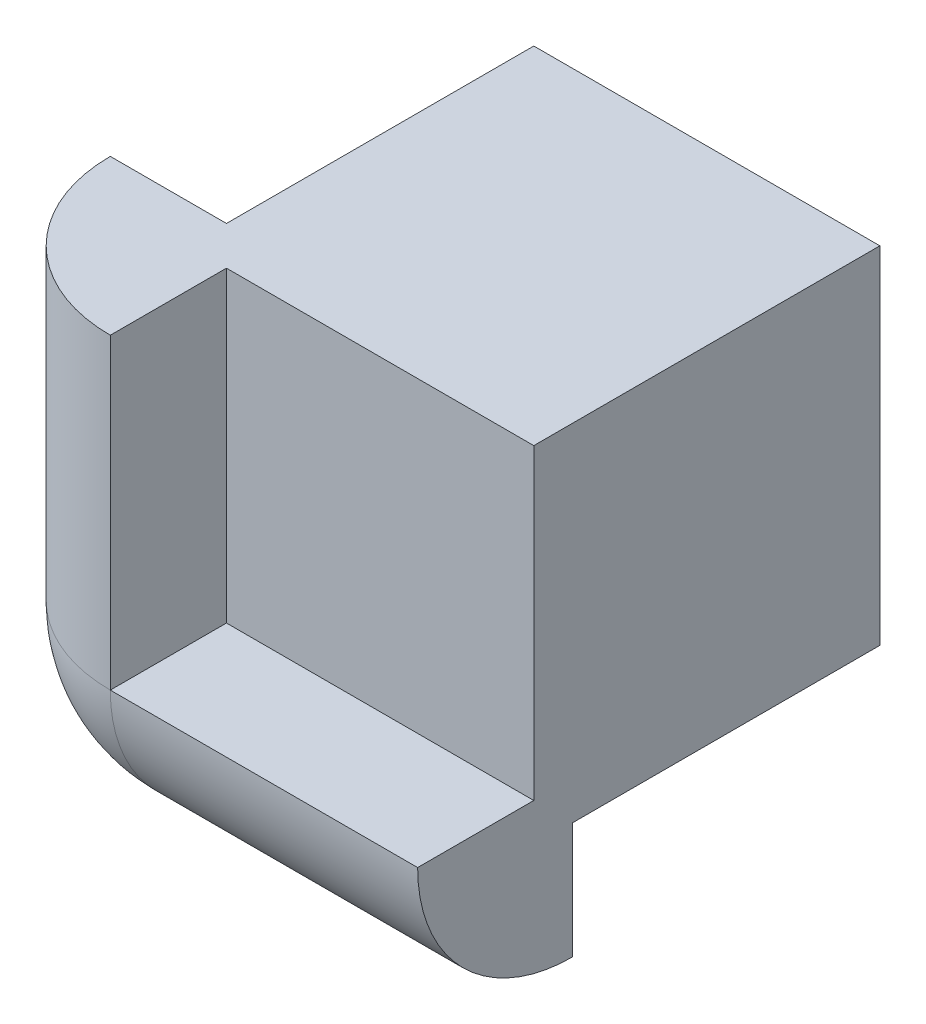
ISO-10303-21;
HEADER;
FILE_DESCRIPTION(('STEP AP214'),'2;1');
FILE_NAME('part.step','',(''),(''),'','','');
FILE_SCHEMA(('AUTOMOTIVE_DESIGN { 1 0 10303 214 1 1 1 1 }'));
ENDSEC;
DATA;
#1=APPLICATION_CONTEXT('core data for automotive mechanical design processes');
#2=APPLICATION_PROTOCOL_DEFINITION('international standard','automotive_design',2000,#1);
#3=PRODUCT_CONTEXT('',#1,'mechanical');
#4=PRODUCT('Part','Part','',(#3));
#5=PRODUCT_RELATED_PRODUCT_CATEGORY('part','',(#4));
#6=PRODUCT_DEFINITION_FORMATION('','',#4);
#7=PRODUCT_DEFINITION_CONTEXT('part definition',#1,'design');
#8=PRODUCT_DEFINITION('design','',#6,#7);
#9=PRODUCT_DEFINITION_SHAPE('','',#8);
#10=(LENGTH_UNIT() NAMED_UNIT(*) SI_UNIT(.MILLI.,.METRE.));
#11=(NAMED_UNIT(*) PLANE_ANGLE_UNIT() SI_UNIT($,.RADIAN.));
#12=(NAMED_UNIT(*) SI_UNIT($,.STERADIAN.) SOLID_ANGLE_UNIT());
#13=UNCERTAINTY_MEASURE_WITH_UNIT(LENGTH_MEASURE(1.E-05),#10,'distance_accuracy_value','');
#14=(GEOMETRIC_REPRESENTATION_CONTEXT(3) GLOBAL_UNCERTAINTY_ASSIGNED_CONTEXT((#13)) GLOBAL_UNIT_ASSIGNED_CONTEXT((#10,
#11,#12)) REPRESENTATION_CONTEXT('',''));
#15=CARTESIAN_POINT('',(0.,0.,0.));
#16=DIRECTION('',(0.,0.,1.));
#17=DIRECTION('',(1.,0.,0.));
#18=AXIS2_PLACEMENT_3D('',#15,#16,#17);
#19=CARTESIAN_POINT('',(8.937498,8.937498,-8.937498));
#20=DIRECTION('',(-1.,0.,0.));
#21=DIRECTION('',(0.,0.,1.));
#22=AXIS2_PLACEMENT_3D('',#19,#20,#21);
#23=PLANE('',#22);
#24=DIRECTION('',(0.,0.,-1.));
#25=VECTOR('',#24,1.);
#26=CARTESIAN_POINT('',(8.937498,0.999999999999997,-1.));
#27=LINE('',#26,#25);
#28=CARTESIAN_POINT('',(8.937498,0.999999999999996,3.));
#29=VERTEX_POINT('',#28);
#30=CARTESIAN_POINT('',(8.937498,0.999999999999997,0.));
#31=VERTEX_POINT('',#30);
#32=EDGE_CURVE('E122',#29,#31,#27,.T.);
#33=ORIENTED_EDGE('',*,*,#32,.F.);
#34=CARTESIAN_POINT('',(8.937498,0.999999999999995,-0.999999999999999));
#35=DIRECTION('',(-1.,0.,0.));
#36=DIRECTION('',(0.,0.,1.));
#37=AXIS2_PLACEMENT_3D('',#34,#35,#36);
#38=CIRCLE('',#37,4.);
#39=CARTESIAN_POINT('',(8.937498,-3.00000000000001,-0.999999999999999));
#40=VERTEX_POINT('',#39);
#41=EDGE_CURVE('E42',#29,#40,#38,.F.);
#42=ORIENTED_EDGE('',*,*,#41,.T.);
#43=DIRECTION('',(0.,-1.,0.));
#44=VECTOR('',#43,1.);
#45=CARTESIAN_POINT('',(8.937498,0.999999999999997,-1.));
#46=LINE('',#45,#44);
#47=CARTESIAN_POINT('',(8.937498,0.,-0.999999999999999));
#48=VERTEX_POINT('',#47);
#49=EDGE_CURVE('E119',#48,#40,#46,.T.);
#50=ORIENTED_EDGE('',*,*,#49,.F.);
#51=DIRECTION('',(0.,0.,-1.));
#52=VECTOR('',#51,1.);
#53=CARTESIAN_POINT('',(8.937498,0.,-8.937498));
#54=LINE('',#53,#52);
#55=CARTESIAN_POINT('',(8.937498,0.,-8.937498));
#56=VERTEX_POINT('',#55);
#57=EDGE_CURVE('E166',#48,#56,#54,.T.);
#58=ORIENTED_EDGE('',*,*,#57,.T.);
#59=DIRECTION('',(0.,-1.,0.));
#60=VECTOR('',#59,1.);
#61=CARTESIAN_POINT('',(8.937498,8.937498,-8.937498));
#62=LINE('',#61,#60);
#63=CARTESIAN_POINT('',(8.937498,8.937498,-8.937498));
#64=VERTEX_POINT('',#63);
#65=EDGE_CURVE('E198',#64,#56,#62,.T.);
#66=ORIENTED_EDGE('',*,*,#65,.F.);
#67=DIRECTION('',(0.,0.,-1.));
#68=VECTOR('',#67,1.);
#69=CARTESIAN_POINT('',(8.937498,8.937498,-8.937498));
#70=LINE('',#69,#68);
#71=CARTESIAN_POINT('',(8.937498,8.937498,0.));
#72=VERTEX_POINT('',#71);
#73=EDGE_CURVE('E167',#72,#64,#70,.T.);
#74=ORIENTED_EDGE('',*,*,#73,.F.);
#75=DIRECTION('',(0.,-1.,0.));
#76=VECTOR('',#75,1.);
#77=CARTESIAN_POINT('',(8.937498,8.937498,0.));
#78=LINE('',#77,#76);
#79=EDGE_CURVE('E181',#72,#31,#78,.T.);
#80=ORIENTED_EDGE('',*,*,#79,.T.);
#81=EDGE_LOOP('',(#33,#42,#50,#58,#66,#74,#80));
#82=FACE_BOUND('',#81,.T.);
#83=ADVANCED_FACE('F33',(#82),#23,.F.);
#84=CARTESIAN_POINT('',(8.937498,8.937498,-8.937498));
#85=DIRECTION('',(0.,0.,1.));
#86=DIRECTION('',(1.,0.,0.));
#87=AXIS2_PLACEMENT_3D('',#84,#85,#86);
#88=PLANE('',#87);
#89=DIRECTION('',(0.,-1.,0.));
#90=VECTOR('',#89,1.);
#91=CARTESIAN_POINT('',(0.999999999999995,-3.00000000000001,-8.937498));
#92=LINE('',#91,#90);
#93=CARTESIAN_POINT('',(0.999999999999995,0.,-8.937498));
#94=VERTEX_POINT('',#93);
#95=CARTESIAN_POINT('',(0.999999999999995,-3.00000000000001,-8.937498));
#96=VERTEX_POINT('',#95);
#97=EDGE_CURVE('E151',#94,#96,#92,.T.);
#98=ORIENTED_EDGE('',*,*,#97,.T.);
#99=CARTESIAN_POINT('',(0.999999999999993,0.999999999999996,-8.937498));
#100=DIRECTION('',(0.,0.,1.));
#101=DIRECTION('',(1.,0.,0.));
#102=AXIS2_PLACEMENT_3D('',#99,#100,#101);
#103=CIRCLE('',#102,4.);
#104=CARTESIAN_POINT('',(-3.00000000000001,0.999999999999997,-8.937498));
#105=VERTEX_POINT('',#104);
#106=EDGE_CURVE('E126',#96,#105,#103,.F.);
#107=ORIENTED_EDGE('',*,*,#106,.T.);
#108=DIRECTION('',(1.,0.,0.));
#109=VECTOR('',#108,1.);
#110=CARTESIAN_POINT('',(-3.,0.999999999999997,-8.937498));
#111=LINE('',#110,#109);
#112=CARTESIAN_POINT('',(0.,0.999999999999997,-8.937498));
#113=VERTEX_POINT('',#112);
#114=EDGE_CURVE('E153',#105,#113,#111,.T.);
#115=ORIENTED_EDGE('',*,*,#114,.T.);
#116=DIRECTION('',(0.,-1.,0.));
#117=VECTOR('',#116,1.);
#118=CARTESIAN_POINT('',(0.,8.937498,-8.937498));
#119=LINE('',#118,#117);
#120=CARTESIAN_POINT('',(0.,8.937498,-8.937498));
#121=VERTEX_POINT('',#120);
#122=EDGE_CURVE('E195',#121,#113,#119,.T.);
#123=ORIENTED_EDGE('',*,*,#122,.F.);
#124=DIRECTION('',(-1.,0.,0.));
#125=VECTOR('',#124,1.);
#126=CARTESIAN_POINT('',(8.937498,8.937498,-8.937498));
#127=LINE('',#126,#125);
#128=EDGE_CURVE('E170',#64,#121,#127,.T.);
#129=ORIENTED_EDGE('',*,*,#128,.F.);
#130=ORIENTED_EDGE('',*,*,#65,.T.);
#131=DIRECTION('',(-1.,0.,0.));
#132=VECTOR('',#131,1.);
#133=CARTESIAN_POINT('',(8.937498,0.,-8.937498));
#134=LINE('',#133,#132);
#135=EDGE_CURVE('E171',#56,#94,#134,.T.);
#136=ORIENTED_EDGE('',*,*,#135,.T.);
#137=EDGE_LOOP('',(#98,#107,#115,#123,#129,#130,#136));
#138=FACE_BOUND('',#137,.T.);
#139=ADVANCED_FACE('F232',(#138),#88,.F.);
#140=CARTESIAN_POINT('',(0.,8.937498,-8.937498));
#141=DIRECTION('',(1.,0.,0.));
#142=DIRECTION('',(0.,0.,-1.));
#143=AXIS2_PLACEMENT_3D('',#140,#141,#142);
#144=PLANE('',#143);
#145=ORIENTED_EDGE('',*,*,#122,.T.);
#146=DIRECTION('',(0.,0.,1.));
#147=VECTOR('',#146,1.);
#148=CARTESIAN_POINT('',(0.,0.999999999999996,-8.937498));
#149=LINE('',#148,#147);
#150=CARTESIAN_POINT('',(0.,0.999999999999996,-1.));
#151=VERTEX_POINT('',#150);
#152=EDGE_CURVE('E163',#113,#151,#149,.T.);
#153=ORIENTED_EDGE('',*,*,#152,.T.);
#154=DIRECTION('',(0.,-1.,0.));
#155=VECTOR('',#154,1.);
#156=CARTESIAN_POINT('',(0.,8.937498,-1.));
#157=LINE('',#156,#155);
#158=CARTESIAN_POINT('',(0.,8.937498,-1.));
#159=VERTEX_POINT('',#158);
#160=EDGE_CURVE('E192',#159,#151,#157,.T.);
#161=ORIENTED_EDGE('',*,*,#160,.F.);
#162=DIRECTION('',(0.,0.,1.));
#163=VECTOR('',#162,1.);
#164=CARTESIAN_POINT('',(0.,8.937498,-8.937498));
#165=LINE('',#164,#163);
#166=EDGE_CURVE('E173',#121,#159,#165,.T.);
#167=ORIENTED_EDGE('',*,*,#166,.F.);
#168=EDGE_LOOP('',(#145,#153,#161,#167));
#169=FACE_BOUND('',#168,.T.);
#170=ADVANCED_FACE('F229',(#169),#144,.F.);
#171=CARTESIAN_POINT('',(-3.00000000000001,8.937498,-0.999999999999999));
#172=DIRECTION('',(0.,0.,1.));
#173=DIRECTION('',(1.,0.,0.));
#174=AXIS2_PLACEMENT_3D('',#171,#172,#173);
#175=PLANE('',#174);
#176=ORIENTED_EDGE('',*,*,#160,.T.);
#177=DIRECTION('',(-1.,0.,0.));
#178=VECTOR('',#177,1.);
#179=CARTESIAN_POINT('',(-3.00000000000001,0.999999999999996,-0.999999999999999));
#180=LINE('',#179,#178);
#181=CARTESIAN_POINT('',(-3.00000000000001,0.999999999999997,-0.999999999999999));
#182=VERTEX_POINT('',#181);
#183=EDGE_CURVE('E160',#151,#182,#180,.T.);
#184=ORIENTED_EDGE('',*,*,#183,.T.);
#185=DIRECTION('',(0.,-1.,0.));
#186=VECTOR('',#185,1.);
#187=CARTESIAN_POINT('',(-3.00000000000001,8.937498,-0.999999999999999));
#188=LINE('',#187,#186);
#189=CARTESIAN_POINT('',(-3.00000000000001,8.937498,-0.999999999999999));
#190=VERTEX_POINT('',#189);
#191=EDGE_CURVE('E189',#190,#182,#188,.T.);
#192=ORIENTED_EDGE('',*,*,#191,.F.);
#193=DIRECTION('',(-1.,0.,0.));
#194=VECTOR('',#193,1.);
#195=CARTESIAN_POINT('',(-3.00000000000001,8.937498,-0.999999999999999));
#196=LINE('',#195,#194);
#197=EDGE_CURVE('E175',#159,#190,#196,.T.);
#198=ORIENTED_EDGE('',*,*,#197,.F.);
#199=EDGE_LOOP('',(#176,#184,#192,#198));
#200=FACE_BOUND('',#199,.T.);
#201=ADVANCED_FACE('F225',(#200),#175,.F.);
#202=CARTESIAN_POINT('',(0.999999999999993,8.937498,3.));
#203=DIRECTION('',(-1.,0.,0.));
#204=DIRECTION('',(0.,0.,1.));
#205=AXIS2_PLACEMENT_3D('',#202,#203,#204);
#206=PLANE('',#205);
#207=DIRECTION('',(0.,-1.,0.));
#208=VECTOR('',#207,1.);
#209=CARTESIAN_POINT('',(0.999999999999993,8.937498,3.));
#210=LINE('',#209,#208);
#211=CARTESIAN_POINT('',(0.999999999999993,8.937498,3.));
#212=VERTEX_POINT('',#211);
#213=CARTESIAN_POINT('',(0.999999999999993,0.999999999999996,3.));
#214=VERTEX_POINT('',#213);
#215=EDGE_CURVE('E50',#212,#214,#210,.T.);
#216=ORIENTED_EDGE('',*,*,#215,.T.);
#217=DIRECTION('',(0.,0.,-1.));
#218=VECTOR('',#217,1.);
#219=CARTESIAN_POINT('',(0.999999999999993,0.999999999999996,3.));
#220=LINE('',#219,#218);
#221=CARTESIAN_POINT('',(0.999999999999995,0.999999999999996,0.));
#222=VERTEX_POINT('',#221);
#223=EDGE_CURVE('E54',#214,#222,#220,.T.);
#224=ORIENTED_EDGE('',*,*,#223,.T.);
#225=DIRECTION('',(0.,-1.,0.));
#226=VECTOR('',#225,1.);
#227=CARTESIAN_POINT('',(0.999999999999995,8.937498,0.));
#228=LINE('',#227,#226);
#229=CARTESIAN_POINT('',(0.999999999999995,8.937498,0.));
#230=VERTEX_POINT('',#229);
#231=EDGE_CURVE('E186',#230,#222,#228,.T.);
#232=ORIENTED_EDGE('',*,*,#231,.F.);
#233=DIRECTION('',(0.,0.,-1.));
#234=VECTOR('',#233,1.);
#235=CARTESIAN_POINT('',(0.999999999999993,8.937498,3.));
#236=LINE('',#235,#234);
#237=EDGE_CURVE('E177',#212,#230,#236,.T.);
#238=ORIENTED_EDGE('',*,*,#237,.F.);
#239=EDGE_LOOP('',(#216,#224,#232,#238));
#240=FACE_BOUND('',#239,.T.);
#241=ADVANCED_FACE('F320',(#240),#206,.F.);
#242=CARTESIAN_POINT('',(8.937498,8.937498,0.));
#243=DIRECTION('',(0.,0.,-1.));
#244=DIRECTION('',(-1.,0.,0.));
#245=AXIS2_PLACEMENT_3D('',#242,#243,#244);
#246=PLANE('',#245);
#247=ORIENTED_EDGE('',*,*,#231,.T.);
#248=DIRECTION('',(1.,0.,0.));
#249=VECTOR('',#248,1.);
#250=CARTESIAN_POINT('',(8.937498,0.999999999999996,0.));
#251=LINE('',#250,#249);
#252=EDGE_CURVE('E204',#222,#31,#251,.T.);
#253=ORIENTED_EDGE('',*,*,#252,.T.);
#254=ORIENTED_EDGE('',*,*,#79,.F.);
#255=DIRECTION('',(1.,0.,0.));
#256=VECTOR('',#255,1.);
#257=CARTESIAN_POINT('',(8.937498,8.937498,0.));
#258=LINE('',#257,#256);
#259=EDGE_CURVE('E179',#230,#72,#258,.T.);
#260=ORIENTED_EDGE('',*,*,#259,.F.);
#261=EDGE_LOOP('',(#247,#253,#254,#260));
#262=FACE_BOUND('',#261,.T.);
#263=ADVANCED_FACE('F248',(#262),#246,.F.);
#264=CARTESIAN_POINT('',(0.,8.937498,0.));
#265=DIRECTION('',(0.,-1.,0.));
#266=DIRECTION('',(0.,0.,-1.));
#267=AXIS2_PLACEMENT_3D('',#264,#265,#266);
#268=PLANE('',#267);
#269=ORIENTED_EDGE('',*,*,#197,.T.);
#270=CARTESIAN_POINT('',(0.999999999999993,8.937498,-0.999999999999999));
#271=DIRECTION('',(0.,-1.,0.));
#272=DIRECTION('',(0.,0.,-1.));
#273=AXIS2_PLACEMENT_3D('',#270,#271,#272);
#274=CIRCLE('',#273,4.);
#275=EDGE_CURVE('E11',#190,#212,#274,.F.);
#276=ORIENTED_EDGE('',*,*,#275,.T.);
#277=ORIENTED_EDGE('',*,*,#237,.T.);
#278=ORIENTED_EDGE('',*,*,#259,.T.);
#279=ORIENTED_EDGE('',*,*,#73,.T.);
#280=ORIENTED_EDGE('',*,*,#128,.T.);
#281=ORIENTED_EDGE('',*,*,#166,.T.);
#282=EDGE_LOOP('',(#269,#276,#277,#278,#279,#280,#281));
#283=FACE_BOUND('',#282,.T.);
#284=ADVANCED_FACE('F245',(#283),#268,.F.);
#285=CARTESIAN_POINT('',(0.,0.,0.));
#286=DIRECTION('',(0.,-1.,0.));
#287=DIRECTION('',(0.,0.,-1.));
#288=AXIS2_PLACEMENT_3D('',#285,#286,#287);
#289=PLANE('',#288);
#290=CARTESIAN_POINT('',(4.968749,0.,-4.968749));
#291=DIRECTION('',(0.,-1.,0.));
#292=DIRECTION('',(0.,0.,-1.));
#293=AXIS2_PLACEMENT_3D('',#290,#291,#292);
#294=CIRCLE('',#293,0.899999999999999);
#295=CARTESIAN_POINT('',(4.968749,0.,-5.868749));
#296=VERTEX_POINT('',#295);
#297=EDGE_CURVE('E369',#296,#296,#294,.T.);
#298=ORIENTED_EDGE('',*,*,#297,.F.);
#299=EDGE_LOOP('',(#298));
#300=FACE_BOUND('',#299,.T.);
#301=DIRECTION('',(1.,0.,0.));
#302=VECTOR('',#301,1.);
#303=CARTESIAN_POINT('',(0.,0.,-1.));
#304=LINE('',#303,#302);
#305=CARTESIAN_POINT('',(0.999999999999995,0.,-1.));
#306=VERTEX_POINT('',#305);
#307=EDGE_CURVE('E135',#306,#48,#304,.T.);
#308=ORIENTED_EDGE('',*,*,#307,.F.);
#309=DIRECTION('',(0.,0.,1.));
#310=VECTOR('',#309,1.);
#311=CARTESIAN_POINT('',(0.999999999999995,0.,0.));
#312=LINE('',#311,#310);
#313=EDGE_CURVE('E201',#94,#306,#312,.T.);
#314=ORIENTED_EDGE('',*,*,#313,.F.);
#315=ORIENTED_EDGE('',*,*,#135,.F.);
#316=ORIENTED_EDGE('',*,*,#57,.F.);
#317=EDGE_LOOP('',(#308,#314,#315,#316));
#318=FACE_BOUND('',#317,.T.);
#319=ADVANCED_FACE('F240',(#300,#318),#289,.T.);
#320=CARTESIAN_POINT('',(-3.00000000000001,0.999999999999997,-14.5943522494924));
#321=DIRECTION('',(0.,1.,0.));
#322=DIRECTION('',(0.,0.,1.));
#323=AXIS2_PLACEMENT_3D('',#320,#321,#322);
#324=PLANE('',#323);
#325=ORIENTED_EDGE('',*,*,#152,.F.);
#326=ORIENTED_EDGE('',*,*,#114,.F.);
#327=DIRECTION('',(0.,0.,1.));
#328=VECTOR('',#327,1.);
#329=CARTESIAN_POINT('',(-3.00000000000001,0.999999999999997,-14.5943522494924));
#330=LINE('',#329,#328);
#331=EDGE_CURVE('E150',#105,#182,#330,.T.);
#332=ORIENTED_EDGE('',*,*,#331,.T.);
#333=ORIENTED_EDGE('',*,*,#183,.F.);
#334=EDGE_LOOP('',(#325,#326,#332,#333));
#335=FACE_BOUND('',#334,.T.);
#336=ADVANCED_FACE('F222',(#335),#324,.T.);
#337=CARTESIAN_POINT('',(0.999999999999995,-3.00000000000001,-14.5943522494924));
#338=DIRECTION('',(1.,0.,0.));
#339=DIRECTION('',(0.,0.,-1.));
#340=AXIS2_PLACEMENT_3D('',#337,#338,#339);
#341=PLANE('',#340);
#342=DIRECTION('',(0.,1.,0.));
#343=VECTOR('',#342,1.);
#344=CARTESIAN_POINT('',(0.999999999999995,-3.,-0.999999999999999));
#345=LINE('',#344,#343);
#346=CARTESIAN_POINT('',(0.999999999999995,-3.00000000000001,-0.999999999999999));
#347=VERTEX_POINT('',#346);
#348=EDGE_CURVE('E143',#347,#306,#345,.T.);
#349=ORIENTED_EDGE('',*,*,#348,.F.);
#350=DIRECTION('',(0.,0.,1.));
#351=VECTOR('',#350,1.);
#352=CARTESIAN_POINT('',(0.999999999999995,-3.00000000000001,-14.5943522494924));
#353=LINE('',#352,#351);
#354=EDGE_CURVE('E154',#96,#347,#353,.T.);
#355=ORIENTED_EDGE('',*,*,#354,.F.);
#356=ORIENTED_EDGE('',*,*,#97,.F.);
#357=ORIENTED_EDGE('',*,*,#313,.T.);
#358=EDGE_LOOP('',(#349,#355,#356,#357));
#359=FACE_BOUND('',#358,.T.);
#360=ADVANCED_FACE('F236',(#359),#341,.T.);
#361=CARTESIAN_POINT('',(8.937498,0.999999999999997,-1.));
#362=DIRECTION('',(0.,1.,0.));
#363=DIRECTION('',(0.,0.,1.));
#364=AXIS2_PLACEMENT_3D('',#361,#362,#363);
#365=PLANE('',#364);
#366=ORIENTED_EDGE('',*,*,#223,.F.);
#367=DIRECTION('',(-1.,0.,0.));
#368=VECTOR('',#367,1.);
#369=CARTESIAN_POINT('',(8.937498,0.999999999999996,3.));
#370=LINE('',#369,#368);
#371=EDGE_CURVE('E141',#29,#214,#370,.T.);
#372=ORIENTED_EDGE('',*,*,#371,.F.);
#373=ORIENTED_EDGE('',*,*,#32,.T.);
#374=ORIENTED_EDGE('',*,*,#252,.F.);
#375=EDGE_LOOP('',(#366,#372,#373,#374));
#376=FACE_BOUND('',#375,.T.);
#377=ADVANCED_FACE('F251',(#376),#365,.T.);
#378=CARTESIAN_POINT('',(8.937498,0.999999999999997,-1.));
#379=DIRECTION('',(0.,0.,-1.));
#380=DIRECTION('',(0.,1.,0.));
#381=AXIS2_PLACEMENT_3D('',#378,#379,#380);
#382=PLANE('',#381);
#383=ORIENTED_EDGE('',*,*,#348,.T.);
#384=ORIENTED_EDGE('',*,*,#307,.T.);
#385=ORIENTED_EDGE('',*,*,#49,.T.);
#386=DIRECTION('',(-1.,0.,0.));
#387=VECTOR('',#386,1.);
#388=CARTESIAN_POINT('',(8.937498,-3.00000000000001,-0.999999999999999));
#389=LINE('',#388,#387);
#390=EDGE_CURVE('E133',#40,#347,#389,.T.);
#391=ORIENTED_EDGE('',*,*,#390,.T.);
#392=EDGE_LOOP('',(#383,#384,#385,#391));
#393=FACE_BOUND('',#392,.T.);
#394=ADVANCED_FACE('F132',(#393),#382,.T.);
#395=CARTESIAN_POINT('',(0.999999999999993,8.937498,-0.999999999999999));
#396=DIRECTION('',(0.,-1.,0.));
#397=DIRECTION('',(0.,0.,-1.));
#398=AXIS2_PLACEMENT_3D('',#395,#396,#397);
#399=CYLINDRICAL_SURFACE('',#398,4.);
#400=ORIENTED_EDGE('',*,*,#275,.F.);
#401=ORIENTED_EDGE('',*,*,#191,.T.);
#402=CARTESIAN_POINT('',(0.999999999999993,0.999999999999995,-0.999999999999999));
#403=DIRECTION('',(0.,-1.,0.));
#404=DIRECTION('',(1.,0.,0.));
#405=AXIS2_PLACEMENT_3D('',#402,#403,#404);
#406=CIRCLE('',#405,4.);
#407=EDGE_CURVE('E37',#214,#182,#406,.T.);
#408=ORIENTED_EDGE('',*,*,#407,.F.);
#409=ORIENTED_EDGE('',*,*,#215,.F.);
#410=EDGE_LOOP('',(#400,#401,#408,#409));
#411=FACE_BOUND('',#410,.T.);
#412=ADVANCED_FACE('F35',(#411),#399,.T.);
#413=CARTESIAN_POINT('',(-3.00000000000001,0.999999999999995,-0.999999999999999));
#414=DIRECTION('',(1.,0.,0.));
#415=DIRECTION('',(0.,0.,-1.));
#416=AXIS2_PLACEMENT_3D('',#413,#414,#415);
#417=CYLINDRICAL_SURFACE('',#416,4.);
#418=ORIENTED_EDGE('',*,*,#41,.F.);
#419=ORIENTED_EDGE('',*,*,#371,.T.);
#420=CARTESIAN_POINT('',(0.999999999999993,0.999999999999995,-0.999999999999999));
#421=DIRECTION('',(-1.,0.,0.));
#422=DIRECTION('',(0.,0.,1.));
#423=AXIS2_PLACEMENT_3D('',#420,#421,#422);
#424=CIRCLE('',#423,4.);
#425=EDGE_CURVE('E139',#347,#214,#424,.T.);
#426=ORIENTED_EDGE('',*,*,#425,.F.);
#427=ORIENTED_EDGE('',*,*,#390,.F.);
#428=EDGE_LOOP('',(#418,#419,#426,#427));
#429=FACE_BOUND('',#428,.T.);
#430=ADVANCED_FACE('F137',(#429),#417,.T.);
#431=CARTESIAN_POINT('',(0.999999999999993,0.999999999999995,-0.999999999999999));
#432=DIRECTION('',(0.,0.,1.));
#433=DIRECTION('',(1.,0.,0.));
#434=AXIS2_PLACEMENT_3D('',#431,#432,#433);
#435=SPHERICAL_SURFACE('',#434,4.);
#436=ORIENTED_EDGE('',*,*,#425,.T.);
#437=ORIENTED_EDGE('',*,*,#407,.T.);
#438=CARTESIAN_POINT('',(0.999999999999993,0.999999999999996,-0.999999999999999));
#439=DIRECTION('',(0.,0.,1.));
#440=DIRECTION('',(1.,0.,0.));
#441=AXIS2_PLACEMENT_3D('',#438,#439,#440);
#442=CIRCLE('',#441,4.);
#443=EDGE_CURVE('E207',#347,#182,#442,.F.);
#444=ORIENTED_EDGE('',*,*,#443,.F.);
#445=EDGE_LOOP('',(#436,#437,#444));
#446=FACE_BOUND('',#445,.T.);
#447=ADVANCED_FACE('F213',(#446),#435,.T.);
#448=CARTESIAN_POINT('',(0.999999999999993,0.999999999999996,3.));
#449=DIRECTION('',(0.,0.,-1.));
#450=DIRECTION('',(-1.,0.,0.));
#451=AXIS2_PLACEMENT_3D('',#448,#449,#450);
#452=CYLINDRICAL_SURFACE('',#451,4.);
#453=ORIENTED_EDGE('',*,*,#106,.F.);
#454=ORIENTED_EDGE('',*,*,#354,.T.);
#455=ORIENTED_EDGE('',*,*,#443,.T.);
#456=ORIENTED_EDGE('',*,*,#331,.F.);
#457=EDGE_LOOP('',(#453,#454,#455,#456));
#458=FACE_BOUND('',#457,.T.);
#459=ADVANCED_FACE('F234',(#458),#452,.T.);
#460=CARTESIAN_POINT('',(4.968749,6.,-4.968749));
#461=DIRECTION('',(0.,-1.,0.));
#462=DIRECTION('',(0.,0.,-1.));
#463=AXIS2_PLACEMENT_3D('',#460,#461,#462);
#464=CYLINDRICAL_SURFACE('',#463,0.899999999999999);
#465=CARTESIAN_POINT('',(4.968749,6.,-4.968749));
#466=DIRECTION('',(0.,-1.,0.));
#467=DIRECTION('',(0.,0.,-1.));
#468=AXIS2_PLACEMENT_3D('',#465,#466,#467);
#469=CIRCLE('',#468,0.899999999999999);
#470=CARTESIAN_POINT('',(4.968749,6.,-5.868749));
#471=VERTEX_POINT('',#470);
#472=EDGE_CURVE('E208',#471,#471,#469,.T.);
#473=ORIENTED_EDGE('',*,*,#472,.F.);
#474=EDGE_LOOP('',(#473));
#475=FACE_BOUND('',#474,.T.);
#476=ORIENTED_EDGE('',*,*,#297,.T.);
#477=EDGE_LOOP('',(#476));
#478=FACE_BOUND('',#477,.T.);
#479=ADVANCED_FACE('F271',(#475,#478),#464,.F.);
#480=CARTESIAN_POINT('',(4.968749,6.,-4.968749));
#481=DIRECTION('',(0.,-1.,0.));
#482=DIRECTION('',(0.,0.,-1.));
#483=AXIS2_PLACEMENT_3D('',#480,#481,#482);
#484=PLANE('',#483);
#485=ORIENTED_EDGE('',*,*,#472,.T.);
#486=EDGE_LOOP('',(#485));
#487=FACE_BOUND('',#486,.T.);
#488=ADVANCED_FACE('F376',(#487),#484,.T.);
#489=CLOSED_SHELL('',(#83,#139,#170,#201,#241,#263,#284,#319,#336,#360,#377,#394,#412,#430,#447,
#459,#479,#488));
#490=MANIFOLD_SOLID_BREP('B2',#489);
#491=ADVANCED_BREP_SHAPE_REPRESENTATION('',(#18,#490),#14);
#492=SHAPE_DEFINITION_REPRESENTATION(#9,#491);
ENDSEC;
END-ISO-10303-21;
